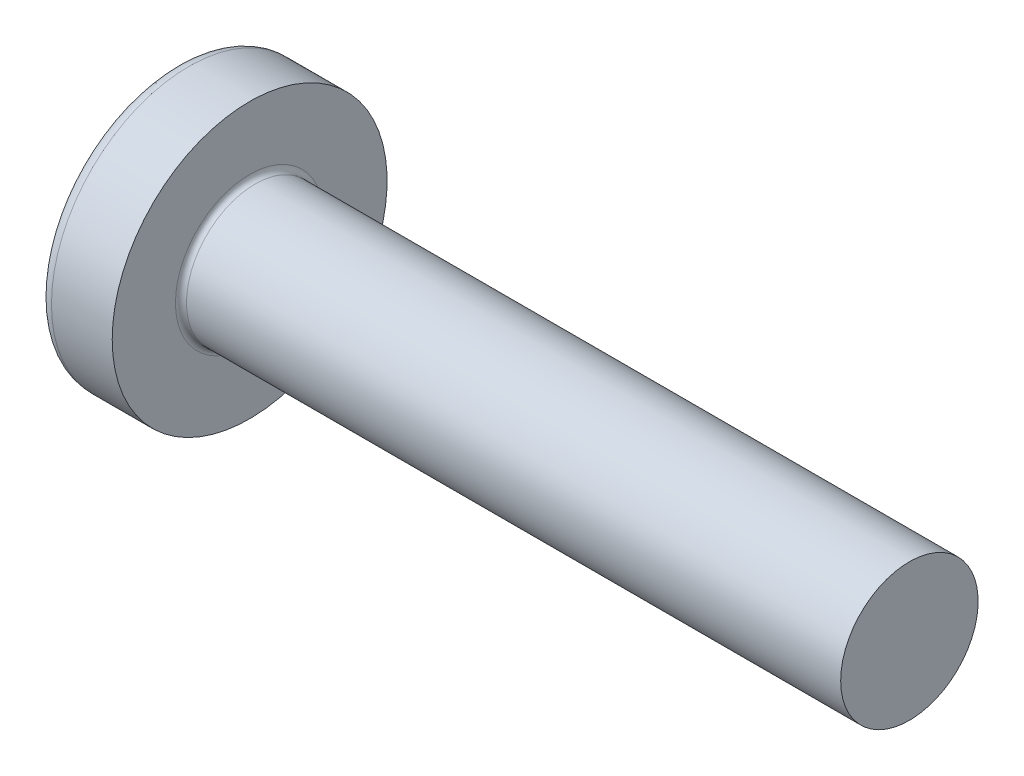
ISO-10303-21;
HEADER;
FILE_DESCRIPTION(('STEP AP214'),'2;1');
FILE_NAME('part.step','',(''),(''),'','','');
FILE_SCHEMA(('AUTOMOTIVE_DESIGN { 1 0 10303 214 1 1 1 1 }'));
ENDSEC;
DATA;
#1=APPLICATION_CONTEXT('core data for automotive mechanical design processes');
#2=APPLICATION_PROTOCOL_DEFINITION('international standard','automotive_design',2000,#1);
#3=PRODUCT_CONTEXT('',#1,'mechanical');
#4=PRODUCT('Part','Part','',(#3));
#5=PRODUCT_RELATED_PRODUCT_CATEGORY('part','',(#4));
#6=PRODUCT_DEFINITION_FORMATION('','',#4);
#7=PRODUCT_DEFINITION_CONTEXT('part definition',#1,'design');
#8=PRODUCT_DEFINITION('design','',#6,#7);
#9=PRODUCT_DEFINITION_SHAPE('','',#8);
#10=(LENGTH_UNIT() NAMED_UNIT(*) SI_UNIT(.MILLI.,.METRE.));
#11=(NAMED_UNIT(*) PLANE_ANGLE_UNIT() SI_UNIT($,.RADIAN.));
#12=(NAMED_UNIT(*) SI_UNIT($,.STERADIAN.) SOLID_ANGLE_UNIT());
#13=UNCERTAINTY_MEASURE_WITH_UNIT(LENGTH_MEASURE(1.E-05),#10,'distance_accuracy_value','');
#14=(GEOMETRIC_REPRESENTATION_CONTEXT(3) GLOBAL_UNCERTAINTY_ASSIGNED_CONTEXT((#13)) GLOBAL_UNIT_ASSIGNED_CONTEXT((#10,
#11,#12)) REPRESENTATION_CONTEXT('',''));
#15=CARTESIAN_POINT('',(0.,0.,0.));
#16=DIRECTION('',(0.,0.,1.));
#17=DIRECTION('',(1.,0.,0.));
#18=AXIS2_PLACEMENT_3D('',#15,#16,#17);
#19=CARTESIAN_POINT('',(4.,0.,0.));
#20=DIRECTION('',(-1.,0.,0.));
#21=DIRECTION('',(0.,1.,0.));
#22=AXIS2_PLACEMENT_3D('',#19,#20,#21);
#23=SPHERICAL_SURFACE('',#22,4.);
#24=CARTESIAN_POINT('',(0.803195914613464,0.,0.));
#25=DIRECTION('',(-1.,0.,0.));
#26=DIRECTION('',(0.,0.,1.));
#27=AXIS2_PLACEMENT_3D('',#24,#25,#26);
#28=CIRCLE('',#27,2.40425531914894);
#29=CARTESIAN_POINT('',(0.803195914613464,0.,2.40425531914894));
#30=VERTEX_POINT('',#29);
#31=EDGE_CURVE('E236',#30,#30,#28,.T.);
#32=ORIENTED_EDGE('',*,*,#31,.T.);
#33=EDGE_LOOP('',(#32));
#34=FACE_BOUND('',#33,.T.);
#35=CARTESIAN_POINT('',(0.0543400780062932,0.,0.));
#36=DIRECTION('',(1.,0.,0.));
#37=DIRECTION('',(0.,0.,-1.));
#38=AXIS2_PLACEMENT_3D('',#35,#36,#37);
#39=CIRCLE('',#38,0.657090389499513);
#40=CARTESIAN_POINT('',(0.0543400780062942,-0.369999999999998,-0.54301729251712));
#41=VERTEX_POINT('',#40);
#42=CARTESIAN_POINT('',(0.0543400780062936,-0.543017292517118,-0.37));
#43=VERTEX_POINT('',#42);
#44=EDGE_CURVE('E372',#41,#43,#39,.F.);
#45=ORIENTED_EDGE('',*,*,#44,.F.);
#46=CARTESIAN_POINT('',(4.,-0.37,0.));
#47=DIRECTION('',(0.,1.,0.));
#48=DIRECTION('',(0.,0.,1.));
#49=AXIS2_PLACEMENT_3D('',#46,#47,#48);
#50=CIRCLE('',#49,3.98285073785097);
#51=CARTESIAN_POINT('',(0.201999107564768,-0.369999999999996,-1.19928696360011));
#52=VERTEX_POINT('',#51);
#53=EDGE_CURVE('E298',#52,#41,#50,.T.);
#54=ORIENTED_EDGE('',*,*,#53,.F.);
#55=CARTESIAN_POINT('',(3.72274316107109,0.,0.556091207572131));
#56=DIRECTION('',(0.446197800778958,0.,-0.894934367749961));
#57=DIRECTION('',(-0.89493436774996,0.,-0.446197800778958));
#58=AXIS2_PLACEMENT_3D('',#55,#56,#57);
#59=CIRCLE('',#58,3.95144166275147);
#60=CARTESIAN_POINT('',(0.201999107564768,0.370000000000004,-1.19928696360011));
#61=VERTEX_POINT('',#60);
#62=EDGE_CURVE('E270',#52,#61,#59,.T.);
#63=ORIENTED_EDGE('',*,*,#62,.T.);
#64=CARTESIAN_POINT('',(4.,0.37,0.));
#65=DIRECTION('',(0.,-1.,0.));
#66=DIRECTION('',(0.,0.,-1.));
#67=AXIS2_PLACEMENT_3D('',#64,#65,#66);
#68=CIRCLE('',#67,3.98285073785097);
#69=CARTESIAN_POINT('',(0.0543400780062943,0.370000000000002,-0.543017292517118));
#70=VERTEX_POINT('',#69);
#71=EDGE_CURVE('E325',#70,#61,#68,.T.);
#72=ORIENTED_EDGE('',*,*,#71,.F.);
#73=CARTESIAN_POINT('',(0.0543400780062936,0.543017292517118,-0.37));
#74=VERTEX_POINT('',#73);
#75=EDGE_CURVE('E391',#74,#70,#39,.F.);
#76=ORIENTED_EDGE('',*,*,#75,.F.);
#77=CARTESIAN_POINT('',(4.,0.,-0.37));
#78=DIRECTION('',(0.,0.,1.));
#79=DIRECTION('',(1.,0.,0.));
#80=AXIS2_PLACEMENT_3D('',#77,#78,#79);
#81=CIRCLE('',#80,3.98285073785097);
#82=CARTESIAN_POINT('',(0.201999107564767,1.19928696360011,-0.37));
#83=VERTEX_POINT('',#82);
#84=EDGE_CURVE('E264',#83,#74,#81,.T.);
#85=ORIENTED_EDGE('',*,*,#84,.F.);
#86=CARTESIAN_POINT('',(3.72274316107109,-0.556091207572131,0.));
#87=DIRECTION('',(0.446197800778958,0.89493436774996,0.));
#88=DIRECTION('',(-0.89493436774996,0.446197800778958,0.));
#89=AXIS2_PLACEMENT_3D('',#86,#87,#88);
#90=CIRCLE('',#89,3.95144166275147);
#91=CARTESIAN_POINT('',(0.201999107564767,1.19928696360011,0.37));
#92=VERTEX_POINT('',#91);
#93=EDGE_CURVE('E267',#83,#92,#90,.T.);
#94=ORIENTED_EDGE('',*,*,#93,.T.);
#95=CARTESIAN_POINT('',(4.,0.,0.37));
#96=DIRECTION('',(0.,0.,-1.));
#97=DIRECTION('',(0.,1.,0.));
#98=AXIS2_PLACEMENT_3D('',#95,#96,#97);
#99=CIRCLE('',#98,3.98285073785097);
#100=CARTESIAN_POINT('',(0.0543400780062936,0.543017292517118,0.37));
#101=VERTEX_POINT('',#100);
#102=EDGE_CURVE('E260',#101,#92,#99,.T.);
#103=ORIENTED_EDGE('',*,*,#102,.F.);
#104=CARTESIAN_POINT('',(0.054340078006295,0.369999999999998,0.54301729251712));
#105=VERTEX_POINT('',#104);
#106=EDGE_CURVE('E390',#105,#101,#39,.F.);
#107=ORIENTED_EDGE('',*,*,#106,.F.);
#108=CARTESIAN_POINT('',(0.201999107564767,0.369999999999996,1.19928696360011));
#109=VERTEX_POINT('',#108);
#110=EDGE_CURVE('E280',#109,#105,#68,.T.);
#111=ORIENTED_EDGE('',*,*,#110,.F.);
#112=CARTESIAN_POINT('',(3.72274316107109,0.,-0.556091207572131));
#113=DIRECTION('',(0.446197800778958,0.,0.89493436774996));
#114=DIRECTION('',(0.89493436774996,0.,-0.446197800778958));
#115=AXIS2_PLACEMENT_3D('',#112,#113,#114);
#116=CIRCLE('',#115,3.95144166275147);
#117=CARTESIAN_POINT('',(0.201999107564767,-0.370000000000004,1.19928696360011));
#118=VERTEX_POINT('',#117);
#119=EDGE_CURVE('E47',#109,#118,#116,.T.);
#120=ORIENTED_EDGE('',*,*,#119,.T.);
#121=CARTESIAN_POINT('',(0.0543400780062934,-0.370000000000002,0.543017292517118));
#122=VERTEX_POINT('',#121);
#123=EDGE_CURVE('E277',#122,#118,#50,.T.);
#124=ORIENTED_EDGE('',*,*,#123,.F.);
#125=CARTESIAN_POINT('',(0.0543400780062936,-0.543017292517118,0.37));
#126=VERTEX_POINT('',#125);
#127=EDGE_CURVE('E426',#126,#122,#39,.F.);
#128=ORIENTED_EDGE('',*,*,#127,.F.);
#129=CARTESIAN_POINT('',(0.201999107564768,-1.19928696360011,0.37));
#130=VERTEX_POINT('',#129);
#131=EDGE_CURVE('E261',#130,#126,#99,.T.);
#132=ORIENTED_EDGE('',*,*,#131,.F.);
#133=CARTESIAN_POINT('',(3.72274316107109,0.55609120757213,0.));
#134=DIRECTION('',(0.446197800778958,-0.894934367749961,0.));
#135=DIRECTION('',(0.89493436774996,0.446197800778958,0.));
#136=AXIS2_PLACEMENT_3D('',#133,#134,#135);
#137=CIRCLE('',#136,3.95144166275147);
#138=CARTESIAN_POINT('',(0.201999107564768,-1.19928696360011,-0.37));
#139=VERTEX_POINT('',#138);
#140=EDGE_CURVE('E257',#130,#139,#137,.T.);
#141=ORIENTED_EDGE('',*,*,#140,.T.);
#142=EDGE_CURVE('E62',#43,#139,#81,.T.);
#143=ORIENTED_EDGE('',*,*,#142,.F.);
#144=EDGE_LOOP('',(#45,#54,#63,#72,#76,#85,#94,#103,#107,#111,#120,#124,#128,#132,#141,#143));
#145=FACE_BOUND('',#144,.T.);
#146=ADVANCED_FACE('F34',(#34,#145),#23,.T.);
#147=CARTESIAN_POINT('',(1.5,0.552127613725262,-0.37));
#148=DIRECTION('',(0.,0.,1.));
#149=DIRECTION('',(1.,0.,0.));
#150=AXIS2_PLACEMENT_3D('',#147,#148,#149);
#151=PLANE('',#150);
#152=ORIENTED_EDGE('',*,*,#84,.T.);
#153=CARTESIAN_POINT('',(-0.98410748766867,0.628943903399942,-0.37));
#154=CARTESIAN_POINT('',(-0.783603343008974,0.612669947295736,-0.37));
#155=CARTESIAN_POINT('',(-0.583110931104086,0.596248129681141,-0.37));
#156=CARTESIAN_POINT('',(-0.182155788452109,0.562989164841715,-0.37));
#157=CARTESIAN_POINT('',(0.0183069414735528,0.546152007726029,-0.37));
#158=CARTESIAN_POINT('',(0.419186928470486,0.511943523152247,-0.37));
#159=CARTESIAN_POINT('',(0.61960418554543,0.4945721957373,-0.37));
#160=CARTESIAN_POINT('',(1.02037173794706,0.459102589125901,-0.37));
#161=CARTESIAN_POINT('',(1.22072203423871,0.441004320904958,-0.37));
#162=CARTESIAN_POINT('',(1.53631168775258,0.411665443099266,-0.37));
#163=CARTESIAN_POINT('',(1.65158348734209,0.400774467003839,-0.37));
#164=CARTESIAN_POINT('',(1.88208360561815,0.378547148308018,-0.37));
#165=CARTESIAN_POINT('',(1.99731192452822,0.367210808029326,-0.37));
#166=CARTESIAN_POINT('',(2.22771614129237,0.343963614894723,-0.37));
#167=CARTESIAN_POINT('',(2.34289203669079,0.332052737461392,-0.37));
#168=CARTESIAN_POINT('',(2.5731581934851,0.30741320876737,-0.37));
#169=CARTESIAN_POINT('',(2.68824845325022,0.294684542317204,-0.37));
#170=CARTESIAN_POINT('',(2.80327961663798,0.281425340988554,-0.37));
#171=B_SPLINE_CURVE_WITH_KNOTS('',3,(#153,#154,#155,#156,#157,#158,#159,#160,#161,#162,#163,
#164,#165,#166,#167,#168,#169,#170),.UNSPECIFIED.,.F.,.F.,(4,2,2,2,2,2,2,2,4),(0.,
0.603490856265068,1.20699609790343,1.81050129079257,2.41399737525255,2.7613521432415,
3.1087051006963,3.45607293033825,3.80344721379854),.UNSPECIFIED.);
#172=CARTESIAN_POINT('',(1.5,0.415013252800437,-0.370000000000001));
#173=VERTEX_POINT('',#172);
#174=EDGE_CURVE('E412',#74,#173,#171,.T.);
#175=ORIENTED_EDGE('',*,*,#174,.T.);
#176=DIRECTION('',(0.,1.,0.));
#177=VECTOR('',#176,1.);
#178=CARTESIAN_POINT('',(1.5,-0.552127613725262,-0.37));
#179=LINE('',#178,#177);
#180=CARTESIAN_POINT('',(1.5,0.552127613725262,-0.37));
#181=VERTEX_POINT('',#180);
#182=EDGE_CURVE('E354',#173,#181,#179,.T.);
#183=ORIENTED_EDGE('',*,*,#182,.T.);
#184=DIRECTION('',(0.89493436774996,-0.446197800778958,0.));
#185=VECTOR('',#184,1.);
#186=CARTESIAN_POINT('',(0.,1.3,-0.37));
#187=LINE('',#186,#185);
#188=EDGE_CURVE('E237',#83,#181,#187,.T.);
#189=ORIENTED_EDGE('',*,*,#188,.F.);
#190=EDGE_LOOP('',(#152,#175,#183,#189));
#191=FACE_BOUND('',#190,.T.);
#192=ADVANCED_FACE('F192',(#191),#151,.T.);
#193=CARTESIAN_POINT('',(1.5,-0.552127613725262,-0.37));
#194=VERTEX_POINT('',#193);
#195=CARTESIAN_POINT('',(1.5,-0.415013252800437,-0.370000000000001));
#196=VERTEX_POINT('',#195);
#197=EDGE_CURVE('E245',#194,#196,#179,.T.);
#198=ORIENTED_EDGE('',*,*,#197,.T.);
#199=CARTESIAN_POINT('',(-0.98410748766867,-0.628943903399942,-0.37));
#200=CARTESIAN_POINT('',(-0.783603343008974,-0.612669947295736,-0.37));
#201=CARTESIAN_POINT('',(-0.583110931104086,-0.596248129681141,-0.37));
#202=CARTESIAN_POINT('',(-0.182155788452109,-0.562989164841715,-0.37));
#203=CARTESIAN_POINT('',(0.0183069414735525,-0.546152007726029,-0.37));
#204=CARTESIAN_POINT('',(0.419186928470486,-0.511943523152247,-0.37));
#205=CARTESIAN_POINT('',(0.619604185545429,-0.4945721957373,-0.37));
#206=CARTESIAN_POINT('',(1.02037173794705,-0.4591025891259,-0.37));
#207=CARTESIAN_POINT('',(1.22072203423871,-0.441004320904958,-0.37));
#208=CARTESIAN_POINT('',(1.53631168775258,-0.411665443099266,-0.37));
#209=CARTESIAN_POINT('',(1.65158348734209,-0.400774467003839,-0.37));
#210=CARTESIAN_POINT('',(1.88208360561815,-0.378547148308018,-0.37));
#211=CARTESIAN_POINT('',(1.99731192452822,-0.367210808029325,-0.37));
#212=CARTESIAN_POINT('',(2.22771614129237,-0.343963614894723,-0.37));
#213=CARTESIAN_POINT('',(2.34289203669079,-0.332052737461392,-0.37));
#214=CARTESIAN_POINT('',(2.5731581934851,-0.30741320876737,-0.37));
#215=CARTESIAN_POINT('',(2.68824845325022,-0.294684542317204,-0.37));
#216=CARTESIAN_POINT('',(2.80327961663798,-0.281425340988554,-0.37));
#217=B_SPLINE_CURVE_WITH_KNOTS('',3,(#199,#200,#201,#202,#203,#204,#205,#206,#207,#208,#209,
#210,#211,#212,#213,#214,#215,#216),.UNSPECIFIED.,.F.,.F.,(4,2,2,2,2,2,2,2,4),(0.,
0.603490856265068,1.20699609790343,1.81050129079257,2.41399737525255,2.7613521432415,
3.1087051006963,3.45607293033825,3.80344721379855),.UNSPECIFIED.);
#218=EDGE_CURVE('E389',#196,#43,#217,.F.);
#219=ORIENTED_EDGE('',*,*,#218,.T.);
#220=ORIENTED_EDGE('',*,*,#142,.T.);
#221=DIRECTION('',(0.89493436774996,0.446197800778958,0.));
#222=VECTOR('',#221,1.);
#223=CARTESIAN_POINT('',(0.,-1.3,-0.37));
#224=LINE('',#223,#222);
#225=EDGE_CURVE('E328',#139,#194,#224,.T.);
#226=ORIENTED_EDGE('',*,*,#225,.T.);
#227=EDGE_LOOP('',(#198,#219,#220,#226));
#228=FACE_BOUND('',#227,.T.);
#229=ADVANCED_FACE('F198',(#228),#151,.T.);
#230=CARTESIAN_POINT('',(1.5,-0.552127613725262,0.37));
#231=DIRECTION('',(0.,0.,-1.));
#232=DIRECTION('',(0.,1.,0.));
#233=AXIS2_PLACEMENT_3D('',#230,#231,#232);
#234=PLANE('',#233);
#235=DIRECTION('',(0.,-1.,0.));
#236=VECTOR('',#235,1.);
#237=CARTESIAN_POINT('',(1.5,0.552127613725262,0.37));
#238=LINE('',#237,#236);
#239=CARTESIAN_POINT('',(1.5,0.552127613725262,0.37));
#240=VERTEX_POINT('',#239);
#241=CARTESIAN_POINT('',(1.5,0.415013252800437,0.370000000000001));
#242=VERTEX_POINT('',#241);
#243=EDGE_CURVE('E337',#240,#242,#238,.T.);
#244=ORIENTED_EDGE('',*,*,#243,.T.);
#245=CARTESIAN_POINT('',(-0.98410748766867,0.628943903399942,0.37));
#246=CARTESIAN_POINT('',(-0.783603343008974,0.612669947295736,0.37));
#247=CARTESIAN_POINT('',(-0.583110931104087,0.596248129681141,0.37));
#248=CARTESIAN_POINT('',(-0.182155788452109,0.562989164841715,0.37));
#249=CARTESIAN_POINT('',(0.0183069414735524,0.546152007726029,0.37));
#250=CARTESIAN_POINT('',(0.419186928470486,0.511943523152247,0.37));
#251=CARTESIAN_POINT('',(0.619604185545429,0.4945721957373,0.37));
#252=CARTESIAN_POINT('',(1.02037173794705,0.459102589125901,0.37));
#253=CARTESIAN_POINT('',(1.22072203423871,0.441004320904958,0.37));
#254=CARTESIAN_POINT('',(1.53631168775258,0.411665443099266,0.37));
#255=CARTESIAN_POINT('',(1.65158348734209,0.400774467003839,0.37));
#256=CARTESIAN_POINT('',(1.88208360561815,0.378547148308018,0.37));
#257=CARTESIAN_POINT('',(1.99731192452822,0.367210808029326,0.37));
#258=CARTESIAN_POINT('',(2.22771614129237,0.343963614894723,0.37));
#259=CARTESIAN_POINT('',(2.34289203669079,0.332052737461392,0.37));
#260=CARTESIAN_POINT('',(2.5731581934851,0.30741320876737,0.37));
#261=CARTESIAN_POINT('',(2.68824845325022,0.294684542317204,0.37));
#262=CARTESIAN_POINT('',(2.80327961663798,0.281425340988554,0.37));
#263=B_SPLINE_CURVE_WITH_KNOTS('',3,(#245,#246,#247,#248,#249,#250,#251,#252,#253,#254,#255,
#256,#257,#258,#259,#260,#261,#262),.UNSPECIFIED.,.F.,.F.,(4,2,2,2,2,2,2,2,4),(0.,
0.603490856265068,1.20699609790343,1.81050129079257,2.41399737525255,2.7613521432415,
3.1087051006963,3.45607293033825,3.80344721379855),.UNSPECIFIED.);
#264=EDGE_CURVE('E664',#242,#101,#263,.F.);
#265=ORIENTED_EDGE('',*,*,#264,.T.);
#266=ORIENTED_EDGE('',*,*,#102,.T.);
#267=DIRECTION('',(0.89493436774996,-0.446197800778958,0.));
#268=VECTOR('',#267,1.);
#269=CARTESIAN_POINT('',(0.,1.3,0.37));
#270=LINE('',#269,#268);
#271=EDGE_CURVE('E242',#92,#240,#270,.T.);
#272=ORIENTED_EDGE('',*,*,#271,.T.);
#273=EDGE_LOOP('',(#244,#265,#266,#272));
#274=FACE_BOUND('',#273,.T.);
#275=ADVANCED_FACE('F408',(#274),#234,.T.);
#276=ORIENTED_EDGE('',*,*,#131,.T.);
#277=CARTESIAN_POINT('',(-0.984107487668669,-0.628943903399942,0.37));
#278=CARTESIAN_POINT('',(-0.783603343008974,-0.612669947295736,0.37));
#279=CARTESIAN_POINT('',(-0.583110931104086,-0.596248129681141,0.37));
#280=CARTESIAN_POINT('',(-0.182155788452109,-0.562989164841715,0.37));
#281=CARTESIAN_POINT('',(0.0183069414735528,-0.546152007726029,0.37));
#282=CARTESIAN_POINT('',(0.419186928470486,-0.511943523152247,0.37));
#283=CARTESIAN_POINT('',(0.61960418554543,-0.4945721957373,0.37));
#284=CARTESIAN_POINT('',(1.02037173794706,-0.459102589125901,0.37));
#285=CARTESIAN_POINT('',(1.22072203423871,-0.441004320904958,0.37));
#286=CARTESIAN_POINT('',(1.53631168775258,-0.411665443099266,0.37));
#287=CARTESIAN_POINT('',(1.65158348734209,-0.400774467003839,0.37));
#288=CARTESIAN_POINT('',(1.88208360561815,-0.378547148308018,0.37));
#289=CARTESIAN_POINT('',(1.99731192452822,-0.367210808029326,0.37));
#290=CARTESIAN_POINT('',(2.22771614129237,-0.343963614894723,0.37));
#291=CARTESIAN_POINT('',(2.34289203669079,-0.332052737461392,0.37));
#292=CARTESIAN_POINT('',(2.5731581934851,-0.307413208767371,0.37));
#293=CARTESIAN_POINT('',(2.68824845325022,-0.294684542317204,0.37));
#294=CARTESIAN_POINT('',(2.80327961663798,-0.281425340988554,0.37));
#295=B_SPLINE_CURVE_WITH_KNOTS('',3,(#277,#278,#279,#280,#281,#282,#283,#284,#285,#286,#287,
#288,#289,#290,#291,#292,#293,#294),.UNSPECIFIED.,.F.,.F.,(4,2,2,2,2,2,2,2,4),(0.,
0.603490856265067,1.20699609790343,1.81050129079257,2.41399737525255,2.7613521432415,
3.1087051006963,3.45607293033825,3.80344721379854),.UNSPECIFIED.);
#296=CARTESIAN_POINT('',(1.5,-0.415013252800437,0.370000000000001));
#297=VERTEX_POINT('',#296);
#298=EDGE_CURVE('E427',#126,#297,#295,.T.);
#299=ORIENTED_EDGE('',*,*,#298,.T.);
#300=CARTESIAN_POINT('',(1.5,-0.552127613725262,0.37));
#301=VERTEX_POINT('',#300);
#302=EDGE_CURVE('E339',#297,#301,#238,.T.);
#303=ORIENTED_EDGE('',*,*,#302,.T.);
#304=DIRECTION('',(0.89493436774996,0.446197800778958,0.));
#305=VECTOR('',#304,1.);
#306=CARTESIAN_POINT('',(0.,-1.3,0.37));
#307=LINE('',#306,#305);
#308=EDGE_CURVE('E330',#130,#301,#307,.T.);
#309=ORIENTED_EDGE('',*,*,#308,.F.);
#310=EDGE_LOOP('',(#276,#299,#303,#309));
#311=FACE_BOUND('',#310,.T.);
#312=ADVANCED_FACE('F518',(#311),#234,.T.);
#313=CARTESIAN_POINT('',(1.5,0.552127613725262,0.37));
#314=DIRECTION('',(0.446197800778958,0.89493436774996,0.));
#315=DIRECTION('',(-0.89493436774996,0.446197800778958,0.));
#316=AXIS2_PLACEMENT_3D('',#313,#314,#315);
#317=PLANE('',#316);
#318=CARTESIAN_POINT('',(2.47007520981164,0.0684659723733946,0.));
#319=DIRECTION('',(0.446197800778958,0.89493436774996,0.));
#320=DIRECTION('',(-0.89493436774996,0.446197800778958,0.));
#321=AXIS2_PLACEMENT_3D('',#318,#319,#320);
#322=ELLIPSE('',#321,1.09405678911959,0.483340660124242);
#323=CARTESIAN_POINT('',(1.5,0.552127613725263,0.0655064741994742));
#324=VERTEX_POINT('',#323);
#325=CARTESIAN_POINT('',(1.5,0.552127613725263,-0.0655064741994742));
#326=VERTEX_POINT('',#325);
#327=EDGE_CURVE('E303',#324,#326,#322,.F.);
#328=ORIENTED_EDGE('',*,*,#327,.F.);
#329=DIRECTION('',(0.,0.,-1.));
#330=VECTOR('',#329,1.);
#331=CARTESIAN_POINT('',(1.5,0.552127613725262,0.37));
#332=LINE('',#331,#330);
#333=EDGE_CURVE('E340',#240,#324,#332,.T.);
#334=ORIENTED_EDGE('',*,*,#333,.F.);
#335=ORIENTED_EDGE('',*,*,#271,.F.);
#336=ORIENTED_EDGE('',*,*,#93,.F.);
#337=ORIENTED_EDGE('',*,*,#188,.T.);
#338=EDGE_CURVE('E342',#326,#181,#332,.T.);
#339=ORIENTED_EDGE('',*,*,#338,.F.);
#340=EDGE_LOOP('',(#328,#334,#335,#336,#337,#339));
#341=FACE_BOUND('',#340,.T.);
#342=ADVANCED_FACE('F406',(#341),#317,.F.);
#343=CARTESIAN_POINT('',(0.,-1.3,-0.37));
#344=DIRECTION('',(0.446197800778958,-0.894934367749961,0.));
#345=DIRECTION('',(0.89493436774996,0.446197800778958,0.));
#346=AXIS2_PLACEMENT_3D('',#343,#344,#345);
#347=PLANE('',#346);
#348=CARTESIAN_POINT('',(2.47007520981164,-0.0684659723733947,0.));
#349=DIRECTION('',(0.446197800778958,-0.894934367749961,0.));
#350=DIRECTION('',(-0.89493436774996,-0.446197800778958,0.));
#351=AXIS2_PLACEMENT_3D('',#348,#349,#350);
#352=ELLIPSE('',#351,1.09405678911959,0.483340660124243);
#353=CARTESIAN_POINT('',(1.5,-0.552127613725263,-0.0655064741994743));
#354=VERTEX_POINT('',#353);
#355=CARTESIAN_POINT('',(1.5,-0.552127613725263,0.0655064741994741));
#356=VERTEX_POINT('',#355);
#357=EDGE_CURVE('E666',#354,#356,#352,.F.);
#358=ORIENTED_EDGE('',*,*,#357,.F.);
#359=DIRECTION('',(0.,0.,1.));
#360=VECTOR('',#359,1.);
#361=CARTESIAN_POINT('',(1.5,-0.552127613725262,-0.37));
#362=LINE('',#361,#360);
#363=EDGE_CURVE('E333',#194,#354,#362,.T.);
#364=ORIENTED_EDGE('',*,*,#363,.F.);
#365=ORIENTED_EDGE('',*,*,#225,.F.);
#366=ORIENTED_EDGE('',*,*,#140,.F.);
#367=ORIENTED_EDGE('',*,*,#308,.T.);
#368=EDGE_CURVE('E336',#356,#301,#362,.T.);
#369=ORIENTED_EDGE('',*,*,#368,.F.);
#370=EDGE_LOOP('',(#358,#364,#365,#366,#367,#369));
#371=FACE_BOUND('',#370,.T.);
#372=ADVANCED_FACE('F505',(#371),#347,.F.);
#373=CARTESIAN_POINT('',(1.5,0.552127613725262,-0.37));
#374=DIRECTION('',(-1.,0.,0.));
#375=DIRECTION('',(0.,0.,1.));
#376=AXIS2_PLACEMENT_3D('',#373,#374,#375);
#377=PLANE('',#376);
#378=DIRECTION('',(0.,1.,0.));
#379=VECTOR('',#378,1.);
#380=CARTESIAN_POINT('',(1.5,-0.370000000000002,0.552127613725261));
#381=LINE('',#380,#379);
#382=CARTESIAN_POINT('',(1.5,-0.370000000000002,0.552127613725261));
#383=VERTEX_POINT('',#382);
#384=CARTESIAN_POINT('',(1.5,-0.0655064741994869,0.552127613725262));
#385=VERTEX_POINT('',#384);
#386=EDGE_CURVE('E318',#383,#385,#381,.T.);
#387=ORIENTED_EDGE('',*,*,#386,.T.);
#388=CARTESIAN_POINT('',(1.5,0.,0.));
#389=DIRECTION('',(-1.,0.,0.));
#390=DIRECTION('',(0.,0.,1.));
#391=AXIS2_PLACEMENT_3D('',#388,#389,#390);
#392=CIRCLE('',#391,0.556);
#393=CARTESIAN_POINT('',(1.5,-0.370000000000001,0.415013252800436));
#394=VERTEX_POINT('',#393);
#395=EDGE_CURVE('E692',#394,#385,#392,.T.);
#396=ORIENTED_EDGE('',*,*,#395,.F.);
#397=DIRECTION('',(0.,0.,-1.));
#398=VECTOR('',#397,1.);
#399=CARTESIAN_POINT('',(1.5,-0.370000000000002,0.552127613725261));
#400=LINE('',#399,#398);
#401=EDGE_CURVE('E314',#383,#394,#400,.T.);
#402=ORIENTED_EDGE('',*,*,#401,.F.);
#403=EDGE_LOOP('',(#387,#396,#402));
#404=FACE_BOUND('',#403,.T.);
#405=ADVANCED_FACE('F462',(#404),#377,.T.);
#406=ORIENTED_EDGE('',*,*,#302,.F.);
#407=EDGE_CURVE('E697',#356,#297,#392,.T.);
#408=ORIENTED_EDGE('',*,*,#407,.F.);
#409=ORIENTED_EDGE('',*,*,#368,.T.);
#410=EDGE_LOOP('',(#406,#408,#409));
#411=FACE_BOUND('',#410,.T.);
#412=ADVANCED_FACE('F492',(#411),#377,.T.);
#413=ORIENTED_EDGE('',*,*,#363,.T.);
#414=EDGE_CURVE('E383',#196,#354,#392,.T.);
#415=ORIENTED_EDGE('',*,*,#414,.F.);
#416=ORIENTED_EDGE('',*,*,#197,.F.);
#417=EDGE_LOOP('',(#413,#415,#416));
#418=FACE_BOUND('',#417,.T.);
#419=ADVANCED_FACE('F486',(#418),#377,.T.);
#420=CARTESIAN_POINT('',(1.5,-0.369999999999998,-0.415013252800437));
#421=VERTEX_POINT('',#420);
#422=CARTESIAN_POINT('',(1.5,-0.369999999999998,-0.552127613725263));
#423=VERTEX_POINT('',#422);
#424=EDGE_CURVE('E317',#421,#423,#400,.T.);
#425=ORIENTED_EDGE('',*,*,#424,.F.);
#426=CARTESIAN_POINT('',(1.5,-0.065506474199485,-0.552127613725262));
#427=VERTEX_POINT('',#426);
#428=EDGE_CURVE('E54',#427,#421,#392,.T.);
#429=ORIENTED_EDGE('',*,*,#428,.F.);
#430=DIRECTION('',(0.,-1.,0.));
#431=VECTOR('',#430,1.);
#432=CARTESIAN_POINT('',(1.5,0.370000000000002,-0.552127613725261));
#433=LINE('',#432,#431);
#434=EDGE_CURVE('E313',#427,#423,#433,.T.);
#435=ORIENTED_EDGE('',*,*,#434,.T.);
#436=EDGE_LOOP('',(#425,#429,#435));
#437=FACE_BOUND('',#436,.T.);
#438=ADVANCED_FACE('F378',(#437),#377,.T.);
#439=CARTESIAN_POINT('',(1.5,0.370000000000002,-0.552127613725261));
#440=VERTEX_POINT('',#439);
#441=CARTESIAN_POINT('',(1.5,0.0655064741994889,-0.552127613725262));
#442=VERTEX_POINT('',#441);
#443=EDGE_CURVE('E310',#440,#442,#433,.T.);
#444=ORIENTED_EDGE('',*,*,#443,.T.);
#445=CARTESIAN_POINT('',(1.5,0.370000000000002,-0.415013252800436));
#446=VERTEX_POINT('',#445);
#447=EDGE_CURVE('E382',#446,#442,#392,.T.);
#448=ORIENTED_EDGE('',*,*,#447,.F.);
#449=DIRECTION('',(0.,0.,1.));
#450=VECTOR('',#449,1.);
#451=CARTESIAN_POINT('',(1.5,0.370000000000002,-0.552127613725261));
#452=LINE('',#451,#450);
#453=EDGE_CURVE('E322',#440,#446,#452,.T.);
#454=ORIENTED_EDGE('',*,*,#453,.F.);
#455=EDGE_LOOP('',(#444,#448,#454));
#456=FACE_BOUND('',#455,.T.);
#457=ADVANCED_FACE('F474',(#456),#377,.T.);
#458=ORIENTED_EDGE('',*,*,#182,.F.);
#459=EDGE_CURVE('E681',#326,#173,#392,.T.);
#460=ORIENTED_EDGE('',*,*,#459,.F.);
#461=ORIENTED_EDGE('',*,*,#338,.T.);
#462=EDGE_LOOP('',(#458,#460,#461));
#463=FACE_BOUND('',#462,.T.);
#464=ADVANCED_FACE('F468',(#463),#377,.T.);
#465=ORIENTED_EDGE('',*,*,#333,.T.);
#466=EDGE_CURVE('E683',#242,#324,#392,.T.);
#467=ORIENTED_EDGE('',*,*,#466,.F.);
#468=ORIENTED_EDGE('',*,*,#243,.F.);
#469=EDGE_LOOP('',(#465,#467,#468));
#470=FACE_BOUND('',#469,.T.);
#471=ADVANCED_FACE('F460',(#470),#377,.T.);
#472=CARTESIAN_POINT('',(1.5,0.369999999999999,0.415013252800439));
#473=VERTEX_POINT('',#472);
#474=CARTESIAN_POINT('',(1.5,0.369999999999998,0.552127613725263));
#475=VERTEX_POINT('',#474);
#476=EDGE_CURVE('E295',#473,#475,#452,.T.);
#477=ORIENTED_EDGE('',*,*,#476,.F.);
#478=CARTESIAN_POINT('',(1.5,0.065506474199483,0.552127613725262));
#479=VERTEX_POINT('',#478);
#480=EDGE_CURVE('E384',#479,#473,#392,.T.);
#481=ORIENTED_EDGE('',*,*,#480,.F.);
#482=EDGE_CURVE('E321',#479,#475,#381,.T.);
#483=ORIENTED_EDGE('',*,*,#482,.T.);
#484=EDGE_LOOP('',(#477,#481,#483));
#485=FACE_BOUND('',#484,.T.);
#486=ADVANCED_FACE('F454',(#485),#377,.T.);
#487=CARTESIAN_POINT('',(1.5,0.369999999999998,0.552127613725263));
#488=DIRECTION('',(0.,-1.,0.));
#489=DIRECTION('',(1.,0.,0.));
#490=AXIS2_PLACEMENT_3D('',#487,#488,#489);
#491=PLANE('',#490);
#492=ORIENTED_EDGE('',*,*,#110,.T.);
#493=CARTESIAN_POINT('',(-0.98410748766867,0.369999999999998,0.628943903399943));
#494=CARTESIAN_POINT('',(-0.783603343008974,0.369999999999998,0.612669947295737));
#495=CARTESIAN_POINT('',(-0.583110931104087,0.369999999999998,0.596248129681142));
#496=CARTESIAN_POINT('',(-0.18215578845211,0.369999999999998,0.562989164841716));
#497=CARTESIAN_POINT('',(0.0183069414735522,0.369999999999998,0.546152007726031));
#498=CARTESIAN_POINT('',(0.419186928470486,0.369999999999998,0.511943523152249));
#499=CARTESIAN_POINT('',(0.619604185545429,0.369999999999998,0.494572195737301));
#500=CARTESIAN_POINT('',(1.02037173794705,0.369999999999998,0.459102589125902));
#501=CARTESIAN_POINT('',(1.22072203423871,0.369999999999998,0.441004320904959));
#502=CARTESIAN_POINT('',(1.53631168775258,0.369999999999999,0.411665443099267));
#503=CARTESIAN_POINT('',(1.65158348734209,0.369999999999999,0.40077446700384));
#504=CARTESIAN_POINT('',(1.88208360561815,0.369999999999999,0.37854714830802));
#505=CARTESIAN_POINT('',(1.99731192452822,0.369999999999999,0.367210808029327));
#506=CARTESIAN_POINT('',(2.22771614129237,0.369999999999999,0.343963614894724));
#507=CARTESIAN_POINT('',(2.34289203669079,0.369999999999999,0.332052737461393));
#508=CARTESIAN_POINT('',(2.5731581934851,0.369999999999999,0.307413208767372));
#509=CARTESIAN_POINT('',(2.68824845325022,0.369999999999999,0.294684542317205));
#510=CARTESIAN_POINT('',(2.80327961663798,0.369999999999999,0.281425340988555));
#511=B_SPLINE_CURVE_WITH_KNOTS('',3,(#493,#494,#495,#496,#497,#498,#499,#500,#501,#502,#503,
#504,#505,#506,#507,#508,#509,#510),.UNSPECIFIED.,.F.,.F.,(4,2,2,2,2,2,2,2,4),(0.,
0.603490856265068,1.20699609790343,1.81050129079257,2.41399737525255,2.7613521432415,
3.1087051006963,3.45607293033825,3.80344721379854),.UNSPECIFIED.);
#512=EDGE_CURVE('E663',#105,#473,#511,.T.);
#513=ORIENTED_EDGE('',*,*,#512,.T.);
#514=ORIENTED_EDGE('',*,*,#476,.T.);
#515=DIRECTION('',(0.89493436774996,0.,-0.446197800778958));
#516=VECTOR('',#515,1.);
#517=CARTESIAN_POINT('',(0.,0.369999999999995,1.3));
#518=LINE('',#517,#516);
#519=EDGE_CURVE('E288',#109,#475,#518,.T.);
#520=ORIENTED_EDGE('',*,*,#519,.F.);
#521=EDGE_LOOP('',(#492,#513,#514,#520));
#522=FACE_BOUND('',#521,.T.);
#523=ADVANCED_FACE('F292',(#522),#491,.T.);
#524=CARTESIAN_POINT('',(1.5,-0.369999999999998,-0.552127613725263));
#525=DIRECTION('',(0.,1.,0.));
#526=DIRECTION('',(0.,0.,1.));
#527=AXIS2_PLACEMENT_3D('',#524,#525,#526);
#528=PLANE('',#527);
#529=ORIENTED_EDGE('',*,*,#401,.T.);
#530=CARTESIAN_POINT('',(-0.98410748766867,-0.370000000000002,0.62894390339994));
#531=CARTESIAN_POINT('',(-0.783603343008974,-0.370000000000002,0.612669947295734));
#532=CARTESIAN_POINT('',(-0.583110931104086,-0.370000000000002,0.59624812968114));
#533=CARTESIAN_POINT('',(-0.182155788452109,-0.370000000000002,0.562989164841714));
#534=CARTESIAN_POINT('',(0.0183069414735532,-0.370000000000002,0.546152007726028));
#535=CARTESIAN_POINT('',(0.419186928470486,-0.370000000000002,0.511943523152246));
#536=CARTESIAN_POINT('',(0.61960418554543,-0.370000000000002,0.494572195737299));
#537=CARTESIAN_POINT('',(1.02037173794706,-0.370000000000002,0.459102589125899));
#538=CARTESIAN_POINT('',(1.22072203423871,-0.370000000000001,0.441004320904957));
#539=CARTESIAN_POINT('',(1.53631168775258,-0.370000000000001,0.411665443099264));
#540=CARTESIAN_POINT('',(1.65158348734209,-0.370000000000001,0.400774467003838));
#541=CARTESIAN_POINT('',(1.88208360561815,-0.370000000000001,0.378547148308017));
#542=CARTESIAN_POINT('',(1.99731192452822,-0.370000000000001,0.367210808029324));
#543=CARTESIAN_POINT('',(2.22771614129237,-0.370000000000001,0.343963614894722));
#544=CARTESIAN_POINT('',(2.34289203669079,-0.370000000000001,0.33205273746139));
#545=CARTESIAN_POINT('',(2.5731581934851,-0.370000000000001,0.307413208767369));
#546=CARTESIAN_POINT('',(2.68824845325022,-0.370000000000001,0.294684542317202));
#547=CARTESIAN_POINT('',(2.80327961663798,-0.370000000000001,0.281425340988552));
#548=B_SPLINE_CURVE_WITH_KNOTS('',3,(#530,#531,#532,#533,#534,#535,#536,#537,#538,#539,#540,
#541,#542,#543,#544,#545,#546,#547),.UNSPECIFIED.,.F.,.F.,(4,2,2,2,2,2,2,2,4),(0.,
0.603490856265068,1.20699609790343,1.81050129079257,2.41399737525255,2.7613521432415,
3.1087051006963,3.45607293033825,3.80344721379854),.UNSPECIFIED.);
#549=EDGE_CURVE('E420',#394,#122,#548,.F.);
#550=ORIENTED_EDGE('',*,*,#549,.T.);
#551=ORIENTED_EDGE('',*,*,#123,.T.);
#552=DIRECTION('',(0.89493436774996,0.,-0.446197800778958));
#553=VECTOR('',#552,1.);
#554=CARTESIAN_POINT('',(0.,-0.370000000000005,1.3));
#555=LINE('',#554,#553);
#556=EDGE_CURVE('E290',#118,#383,#555,.T.);
#557=ORIENTED_EDGE('',*,*,#556,.T.);
#558=EDGE_LOOP('',(#529,#550,#551,#557));
#559=FACE_BOUND('',#558,.T.);
#560=ADVANCED_FACE('F227',(#559),#528,.T.);
#561=CARTESIAN_POINT('',(1.5,-0.370000000000002,0.552127613725261));
#562=DIRECTION('',(0.446197800778958,0.,0.89493436774996));
#563=DIRECTION('',(-0.89493436774996,0.,0.446197800778958));
#564=AXIS2_PLACEMENT_3D('',#561,#562,#563);
#565=PLANE('',#564);
#566=CARTESIAN_POINT('',(2.47007520981164,0.,0.0684659723733946));
#567=DIRECTION('',(0.446197800778958,0.,0.89493436774996));
#568=DIRECTION('',(-0.89493436774996,0.,0.446197800778958));
#569=AXIS2_PLACEMENT_3D('',#566,#567,#568);
#570=ELLIPSE('',#569,1.09405678911959,0.483340660124242);
#571=EDGE_CURVE('E418',#385,#479,#570,.F.);
#572=ORIENTED_EDGE('',*,*,#571,.F.);
#573=ORIENTED_EDGE('',*,*,#386,.F.);
#574=ORIENTED_EDGE('',*,*,#556,.F.);
#575=ORIENTED_EDGE('',*,*,#119,.F.);
#576=ORIENTED_EDGE('',*,*,#519,.T.);
#577=ORIENTED_EDGE('',*,*,#482,.F.);
#578=EDGE_LOOP('',(#572,#573,#574,#575,#576,#577));
#579=FACE_BOUND('',#578,.T.);
#580=ADVANCED_FACE('F286',(#579),#565,.F.);
#581=CARTESIAN_POINT('',(0.,0.370000000000005,-1.3));
#582=DIRECTION('',(0.446197800778958,0.,-0.894934367749961));
#583=DIRECTION('',(0.89493436774996,0.,0.446197800778958));
#584=AXIS2_PLACEMENT_3D('',#581,#582,#583);
#585=PLANE('',#584);
#586=CARTESIAN_POINT('',(2.47007520981164,0.,-0.0684659723733947));
#587=DIRECTION('',(0.446197800778958,0.,-0.894934367749961));
#588=DIRECTION('',(-0.89493436774996,0.,-0.446197800778958));
#589=AXIS2_PLACEMENT_3D('',#586,#587,#588);
#590=ELLIPSE('',#589,1.09405678911959,0.483340660124243);
#591=EDGE_CURVE('E376',#442,#427,#590,.F.);
#592=ORIENTED_EDGE('',*,*,#591,.F.);
#593=ORIENTED_EDGE('',*,*,#443,.F.);
#594=DIRECTION('',(0.89493436774996,0.,0.446197800778958));
#595=VECTOR('',#594,1.);
#596=CARTESIAN_POINT('',(0.,0.370000000000005,-1.3));
#597=LINE('',#596,#595);
#598=EDGE_CURVE('E300',#61,#440,#597,.T.);
#599=ORIENTED_EDGE('',*,*,#598,.F.);
#600=ORIENTED_EDGE('',*,*,#62,.F.);
#601=DIRECTION('',(0.89493436774996,0.,0.446197800778958));
#602=VECTOR('',#601,1.);
#603=CARTESIAN_POINT('',(0.,-0.369999999999995,-1.3));
#604=LINE('',#603,#602);
#605=EDGE_CURVE('E307',#52,#423,#604,.T.);
#606=ORIENTED_EDGE('',*,*,#605,.T.);
#607=ORIENTED_EDGE('',*,*,#434,.F.);
#608=EDGE_LOOP('',(#592,#593,#599,#600,#606,#607));
#609=FACE_BOUND('',#608,.T.);
#610=ADVANCED_FACE('F367',(#609),#585,.F.);
#611=ORIENTED_EDGE('',*,*,#453,.T.);
#612=CARTESIAN_POINT('',(-0.984107487670367,0.370000000000002,-0.628943903400078));
#613=CARTESIAN_POINT('',(-0.783603343010497,0.370000000000002,-0.612669947295859));
#614=CARTESIAN_POINT('',(-0.583110931105435,0.370000000000002,-0.596248129681251));
#615=CARTESIAN_POINT('',(-0.182155788453109,0.370000000000002,-0.562989164841798));
#616=CARTESIAN_POINT('',(0.018306941472727,0.370000000000002,-0.546152007726098));
#617=CARTESIAN_POINT('',(0.419186928470242,0.370000000000002,-0.511943523152268));
#618=CARTESIAN_POINT('',(0.619604185545594,0.370000000000002,-0.494572195737285));
#619=CARTESIAN_POINT('',(1.02037173794803,0.370000000000002,-0.459102589125812));
#620=CARTESIAN_POINT('',(1.2207220342401,0.370000000000001,-0.441004320904831));
#621=CARTESIAN_POINT('',(1.53631168775438,0.370000000000001,-0.411665443099096));
#622=CARTESIAN_POINT('',(1.65158348734389,0.370000000000001,-0.400774467003667));
#623=CARTESIAN_POINT('',(1.88208360561995,0.370000000000001,-0.378547148307842));
#624=CARTESIAN_POINT('',(1.99731192453001,0.370000000000001,-0.367210808029147));
#625=CARTESIAN_POINT('',(2.22771614129417,0.370000000000001,-0.343963614894538));
#626=CARTESIAN_POINT('',(2.34289203669258,0.370000000000001,-0.332052737461203));
#627=CARTESIAN_POINT('',(2.57315819348689,0.370000000000001,-0.307413208767173));
#628=CARTESIAN_POINT('',(2.68824845325201,0.370000000000001,-0.294684542317002));
#629=CARTESIAN_POINT('',(2.80327961663977,0.370000000000001,-0.281425340988346));
#630=B_SPLINE_CURVE_WITH_KNOTS('',3,(#612,#613,#614,#615,#616,#617,#618,#619,#620,#621,#622,
#623,#624,#625,#626,#627,#628,#629),.UNSPECIFIED.,.F.,.F.,(4,2,2,2,2,2,2,2,4),(0.,
0.603490856265592,1.20699609790448,1.81050129079485,2.41399737525605,2.76135214324501,
3.1087051006998,3.45607293034176,3.80344721380205),.UNSPECIFIED.);
#631=EDGE_CURVE('E363',#446,#70,#630,.F.);
#632=ORIENTED_EDGE('',*,*,#631,.T.);
#633=ORIENTED_EDGE('',*,*,#71,.T.);
#634=ORIENTED_EDGE('',*,*,#598,.T.);
#635=EDGE_LOOP('',(#611,#632,#633,#634));
#636=FACE_BOUND('',#635,.T.);
#637=ADVANCED_FACE('F225',(#636),#491,.T.);
#638=ORIENTED_EDGE('',*,*,#53,.T.);
#639=CARTESIAN_POINT('',(-0.984107487670368,-0.369999999999998,-0.628943903400081));
#640=CARTESIAN_POINT('',(-0.783603343010498,-0.369999999999998,-0.612669947295862));
#641=CARTESIAN_POINT('',(-0.583110931105436,-0.369999999999998,-0.596248129681253));
#642=CARTESIAN_POINT('',(-0.18215578845311,-0.369999999999998,-0.5629891648418));
#643=CARTESIAN_POINT('',(0.0183069414727262,-0.369999999999998,-0.546152007726101));
#644=CARTESIAN_POINT('',(0.419186928470242,-0.369999999999998,-0.51194352315227));
#645=CARTESIAN_POINT('',(0.619604185545594,-0.369999999999998,-0.494572195737287));
#646=CARTESIAN_POINT('',(1.02037173794803,-0.369999999999998,-0.459102589125815));
#647=CARTESIAN_POINT('',(1.2207220342401,-0.369999999999998,-0.441004320904834));
#648=CARTESIAN_POINT('',(1.53631168775438,-0.369999999999998,-0.411665443099098));
#649=CARTESIAN_POINT('',(1.65158348734389,-0.369999999999998,-0.40077446700367));
#650=CARTESIAN_POINT('',(1.88208360561995,-0.369999999999999,-0.378547148307844));
#651=CARTESIAN_POINT('',(1.99731192453001,-0.369999999999999,-0.367210808029149));
#652=CARTESIAN_POINT('',(2.22771614129417,-0.369999999999999,-0.343963614894541));
#653=CARTESIAN_POINT('',(2.34289203669258,-0.369999999999999,-0.332052737461206));
#654=CARTESIAN_POINT('',(2.57315819348689,-0.369999999999999,-0.307413208767176));
#655=CARTESIAN_POINT('',(2.68824845325201,-0.369999999999999,-0.294684542317004));
#656=CARTESIAN_POINT('',(2.80327961663977,-0.369999999999999,-0.281425340988348));
#657=B_SPLINE_CURVE_WITH_KNOTS('',3,(#639,#640,#641,#642,#643,#644,#645,#646,#647,#648,#649,
#650,#651,#652,#653,#654,#655,#656),.UNSPECIFIED.,.F.,.F.,(4,2,2,2,2,2,2,2,4),(0.,
0.603490856265592,1.20699609790448,1.81050129079485,2.41399737525605,2.76135214324501,
3.1087051006998,3.45607293034176,3.80344721380205),.UNSPECIFIED.);
#658=EDGE_CURVE('E11',#41,#421,#657,.T.);
#659=ORIENTED_EDGE('',*,*,#658,.T.);
#660=ORIENTED_EDGE('',*,*,#424,.T.);
#661=ORIENTED_EDGE('',*,*,#605,.F.);
#662=EDGE_LOOP('',(#638,#659,#660,#661));
#663=FACE_BOUND('',#662,.T.);
#664=ADVANCED_FACE('F220',(#663),#528,.T.);
#665=CARTESIAN_POINT('',(-25.4,0.,0.));
#666=DIRECTION('',(-1.,0.,0.));
#667=DIRECTION('',(0.,0.,1.));
#668=AXIS2_PLACEMENT_3D('',#665,#666,#667);
#669=CYLINDRICAL_SURFACE('',#668,1.25);
#670=CARTESIAN_POINT('',(2.2,0.,0.));
#671=DIRECTION('',(-1.,0.,0.));
#672=DIRECTION('',(0.,0.,1.));
#673=AXIS2_PLACEMENT_3D('',#670,#671,#672);
#674=CIRCLE('',#673,1.25);
#675=CARTESIAN_POINT('',(2.2,0.,1.25));
#676=VERTEX_POINT('',#675);
#677=EDGE_CURVE('E231',#676,#676,#674,.F.);
#678=ORIENTED_EDGE('',*,*,#677,.T.);
#679=EDGE_LOOP('',(#678));
#680=FACE_BOUND('',#679,.T.);
#681=CARTESIAN_POINT('',(14.1,0.,0.));
#682=DIRECTION('',(-1.,0.,0.));
#683=DIRECTION('',(0.,0.,1.));
#684=AXIS2_PLACEMENT_3D('',#681,#682,#683);
#685=CIRCLE('',#684,1.25);
#686=CARTESIAN_POINT('',(14.1,0.,1.25));
#687=VERTEX_POINT('',#686);
#688=EDGE_CURVE('E234',#687,#687,#685,.T.);
#689=ORIENTED_EDGE('',*,*,#688,.T.);
#690=EDGE_LOOP('',(#689));
#691=FACE_BOUND('',#690,.T.);
#692=ADVANCED_FACE('F217',(#680,#691),#669,.T.);
#693=CARTESIAN_POINT('',(2.1,1.25,0.));
#694=DIRECTION('',(-1.,0.,0.));
#695=DIRECTION('',(0.,0.,1.));
#696=AXIS2_PLACEMENT_3D('',#693,#694,#695);
#697=PLANE('',#696);
#698=CARTESIAN_POINT('',(2.1,0.,0.));
#699=DIRECTION('',(-1.,0.,0.));
#700=DIRECTION('',(0.,0.,1.));
#701=AXIS2_PLACEMENT_3D('',#698,#699,#700);
#702=CIRCLE('',#701,1.35);
#703=CARTESIAN_POINT('',(2.1,0.,1.35));
#704=VERTEX_POINT('',#703);
#705=EDGE_CURVE('E253',#704,#704,#702,.T.);
#706=ORIENTED_EDGE('',*,*,#705,.T.);
#707=EDGE_LOOP('',(#706));
#708=FACE_BOUND('',#707,.T.);
#709=CARTESIAN_POINT('',(2.1,0.,0.));
#710=DIRECTION('',(-1.,0.,0.));
#711=DIRECTION('',(0.,0.,1.));
#712=AXIS2_PLACEMENT_3D('',#709,#710,#711);
#713=CIRCLE('',#712,2.5);
#714=CARTESIAN_POINT('',(2.1,0.,2.5));
#715=VERTEX_POINT('',#714);
#716=EDGE_CURVE('E250',#715,#715,#713,.T.);
#717=ORIENTED_EDGE('',*,*,#716,.F.);
#718=EDGE_LOOP('',(#717));
#719=FACE_BOUND('',#718,.T.);
#720=ADVANCED_FACE('F214',(#708,#719),#697,.F.);
#721=CARTESIAN_POINT('',(-25.4,0.,0.));
#722=DIRECTION('',(-1.,0.,0.));
#723=DIRECTION('',(0.,0.,1.));
#724=AXIS2_PLACEMENT_3D('',#721,#722,#723);
#725=CYLINDRICAL_SURFACE('',#724,2.5);
#726=ORIENTED_EDGE('',*,*,#716,.T.);
#727=EDGE_LOOP('',(#726));
#728=FACE_BOUND('',#727,.T.);
#729=CARTESIAN_POINT('',(0.995004159736655,0.,0.));
#730=DIRECTION('',(-1.,0.,0.));
#731=DIRECTION('',(0.,0.,1.));
#732=AXIS2_PLACEMENT_3D('',#729,#730,#731);
#733=CIRCLE('',#732,2.5);
#734=CARTESIAN_POINT('',(0.995004159736655,0.,2.5));
#735=VERTEX_POINT('',#734);
#736=EDGE_CURVE('E239',#735,#735,#733,.T.);
#737=ORIENTED_EDGE('',*,*,#736,.F.);
#738=EDGE_LOOP('',(#737));
#739=FACE_BOUND('',#738,.T.);
#740=ADVANCED_FACE('F210',(#728,#739),#725,.T.);
#741=CARTESIAN_POINT('',(0.995004159736656,0.,0.));
#742=DIRECTION('',(-1.,0.,0.));
#743=DIRECTION('',(0.,0.,1.));
#744=AXIS2_PLACEMENT_3D('',#741,#742,#743);
#745=TOROIDAL_SURFACE('',#744,2.26,0.24);
#746=ORIENTED_EDGE('',*,*,#736,.T.);
#747=EDGE_LOOP('',(#746));
#748=FACE_BOUND('',#747,.T.);
#749=ORIENTED_EDGE('',*,*,#31,.F.);
#750=EDGE_LOOP('',(#749));
#751=FACE_BOUND('',#750,.T.);
#752=ADVANCED_FACE('F207',(#748,#751),#745,.T.);
#753=CARTESIAN_POINT('',(14.1,1.25,0.));
#754=DIRECTION('',(1.,0.,0.));
#755=DIRECTION('',(0.,0.,-1.));
#756=AXIS2_PLACEMENT_3D('',#753,#754,#755);
#757=PLANE('',#756);
#758=ORIENTED_EDGE('',*,*,#688,.F.);
#759=EDGE_LOOP('',(#758));
#760=FACE_BOUND('',#759,.T.);
#761=ADVANCED_FACE('F205',(#760),#757,.T.);
#762=CARTESIAN_POINT('',(2.2,0.,0.));
#763=DIRECTION('',(-1.,0.,0.));
#764=DIRECTION('',(0.,0.,1.));
#765=AXIS2_PLACEMENT_3D('',#762,#763,#764);
#766=TOROIDAL_SURFACE('',#765,1.35,0.1);
#767=ORIENTED_EDGE('',*,*,#677,.F.);
#768=EDGE_LOOP('',(#767));
#769=FACE_BOUND('',#768,.T.);
#770=ORIENTED_EDGE('',*,*,#705,.F.);
#771=EDGE_LOOP('',(#770));
#772=FACE_BOUND('',#771,.T.);
#773=ADVANCED_FACE('F36',(#769,#772),#766,.F.);
#774=CARTESIAN_POINT('',(1.5,0.,0.));
#775=DIRECTION('',(-1.,0.,0.));
#776=DIRECTION('',(0.,0.,1.));
#777=AXIS2_PLACEMENT_3D('',#774,#775,#776);
#778=CONICAL_SURFACE('',#777,0.556,0.069813170079766);
#779=ORIENTED_EDGE('',*,*,#327,.T.);
#780=EDGE_CURVE('E678',#324,#326,#392,.T.);
#781=ORIENTED_EDGE('',*,*,#780,.F.);
#782=EDGE_LOOP('',(#779,#781));
#783=FACE_BOUND('',#782,.T.);
#784=ADVANCED_FACE('F189',(#783),#778,.F.);
#785=ORIENTED_EDGE('',*,*,#357,.T.);
#786=EDGE_CURVE('E698',#354,#356,#392,.T.);
#787=ORIENTED_EDGE('',*,*,#786,.F.);
#788=EDGE_LOOP('',(#785,#787));
#789=FACE_BOUND('',#788,.T.);
#790=ADVANCED_FACE('F593',(#789),#778,.F.);
#791=EDGE_CURVE('E386',#473,#242,#392,.T.);
#792=ORIENTED_EDGE('',*,*,#791,.F.);
#793=ORIENTED_EDGE('',*,*,#512,.F.);
#794=ORIENTED_EDGE('',*,*,#106,.T.);
#795=ORIENTED_EDGE('',*,*,#264,.F.);
#796=EDGE_LOOP('',(#792,#793,#794,#795));
#797=FACE_BOUND('',#796,.T.);
#798=ADVANCED_FACE('F600',(#797),#778,.F.);
#799=ORIENTED_EDGE('',*,*,#571,.T.);
#800=EDGE_CURVE('E387',#385,#479,#392,.T.);
#801=ORIENTED_EDGE('',*,*,#800,.F.);
#802=EDGE_LOOP('',(#799,#801));
#803=FACE_BOUND('',#802,.T.);
#804=ADVANCED_FACE('F607',(#803),#778,.F.);
#805=ORIENTED_EDGE('',*,*,#591,.T.);
#806=EDGE_CURVE('E379',#442,#427,#392,.T.);
#807=ORIENTED_EDGE('',*,*,#806,.F.);
#808=EDGE_LOOP('',(#805,#807));
#809=FACE_BOUND('',#808,.T.);
#810=ADVANCED_FACE('F614',(#809),#778,.F.);
#811=ORIENTED_EDGE('',*,*,#127,.T.);
#812=ORIENTED_EDGE('',*,*,#549,.F.);
#813=EDGE_CURVE('E694',#297,#394,#392,.T.);
#814=ORIENTED_EDGE('',*,*,#813,.F.);
#815=ORIENTED_EDGE('',*,*,#298,.F.);
#816=EDGE_LOOP('',(#811,#812,#814,#815));
#817=FACE_BOUND('',#816,.T.);
#818=ADVANCED_FACE('F621',(#817),#778,.F.);
#819=ORIENTED_EDGE('',*,*,#75,.T.);
#820=ORIENTED_EDGE('',*,*,#631,.F.);
#821=EDGE_CURVE('E684',#173,#446,#392,.T.);
#822=ORIENTED_EDGE('',*,*,#821,.F.);
#823=ORIENTED_EDGE('',*,*,#174,.F.);
#824=EDGE_LOOP('',(#819,#820,#822,#823));
#825=FACE_BOUND('',#824,.T.);
#826=ADVANCED_FACE('F187',(#825),#778,.F.);
#827=EDGE_CURVE('E380',#421,#196,#392,.T.);
#828=ORIENTED_EDGE('',*,*,#827,.F.);
#829=ORIENTED_EDGE('',*,*,#658,.F.);
#830=ORIENTED_EDGE('',*,*,#44,.T.);
#831=ORIENTED_EDGE('',*,*,#218,.F.);
#832=EDGE_LOOP('',(#828,#829,#830,#831));
#833=FACE_BOUND('',#832,.T.);
#834=ADVANCED_FACE('F182',(#833),#778,.F.);
#835=CARTESIAN_POINT('',(1.68065535110549,0.,0.));
#836=DIRECTION('',(-1.,0.,0.));
#837=DIRECTION('',(0.,0.,1.));
#838=AXIS2_PLACEMENT_3D('',#835,#836,#837);
#839=CONICAL_SURFACE('',#838,0.,1.25663706143592);
#840=ORIENTED_EDGE('',*,*,#480,.T.);
#841=ORIENTED_EDGE('',*,*,#791,.T.);
#842=ORIENTED_EDGE('',*,*,#466,.T.);
#843=ORIENTED_EDGE('',*,*,#780,.T.);
#844=ORIENTED_EDGE('',*,*,#459,.T.);
#845=ORIENTED_EDGE('',*,*,#821,.T.);
#846=ORIENTED_EDGE('',*,*,#447,.T.);
#847=ORIENTED_EDGE('',*,*,#806,.T.);
#848=ORIENTED_EDGE('',*,*,#428,.T.);
#849=ORIENTED_EDGE('',*,*,#827,.T.);
#850=ORIENTED_EDGE('',*,*,#414,.T.);
#851=ORIENTED_EDGE('',*,*,#786,.T.);
#852=ORIENTED_EDGE('',*,*,#407,.T.);
#853=ORIENTED_EDGE('',*,*,#813,.T.);
#854=ORIENTED_EDGE('',*,*,#395,.T.);
#855=ORIENTED_EDGE('',*,*,#800,.T.);
#856=EDGE_LOOP('',(#840,#841,#842,#843,#844,#845,#846,#847,#848,#849,#850,#851,#852,#853,#854,#855));
#857=FACE_BOUND('',#856,.T.);
#858=CARTESIAN_POINT('',(1.68065535110549,0.,0.));
#859=VERTEX_POINT('',#858);
#860=VERTEX_LOOP('',#859);
#861=FACE_BOUND('',#860,.T.);
#862=ADVANCED_FACE('F180',(#857,#861),#839,.F.);
#863=CLOSED_SHELL('',(#146,#192,#229,#275,#312,#342,#372,#405,#412,#419,#438,#457,#464,#471,
#486,#523,#560,#580,#610,#637,#664,#692,#720,#740,#752,#761,#773,#784,#790,#798,#804,#810,#818,
#826,#834,#862));
#864=MANIFOLD_SOLID_BREP('B2',#863);
#865=ADVANCED_BREP_SHAPE_REPRESENTATION('',(#18,#864),#14);
#866=SHAPE_DEFINITION_REPRESENTATION(#9,#865);
ENDSEC;
END-ISO-10303-21;
